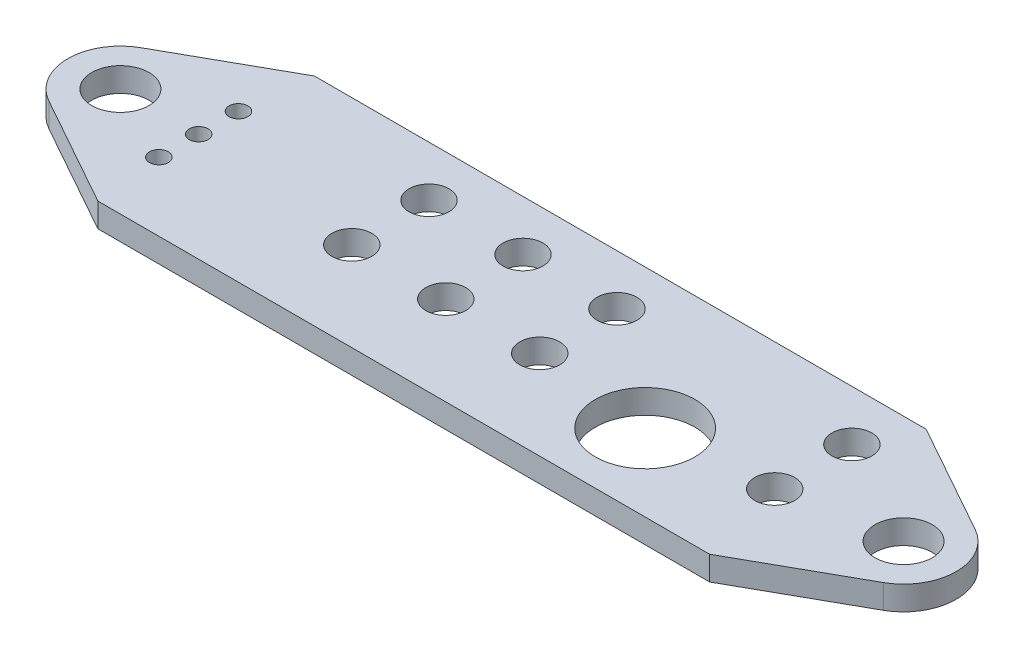
ISO-10303-21;
HEADER;
FILE_DESCRIPTION(('STEP AP214'),'2;1');
FILE_NAME('part.step','',(''),(''),'','','');
FILE_SCHEMA(('AUTOMOTIVE_DESIGN { 1 0 10303 214 1 1 1 1 }'));
ENDSEC;
DATA;
#1=APPLICATION_CONTEXT('core data for automotive mechanical design processes');
#2=APPLICATION_PROTOCOL_DEFINITION('international standard','automotive_design',2000,#1);
#3=PRODUCT_CONTEXT('',#1,'mechanical');
#4=PRODUCT('Part','Part','',(#3));
#5=PRODUCT_RELATED_PRODUCT_CATEGORY('part','',(#4));
#6=PRODUCT_DEFINITION_FORMATION('','',#4);
#7=PRODUCT_DEFINITION_CONTEXT('part definition',#1,'design');
#8=PRODUCT_DEFINITION('design','',#6,#7);
#9=PRODUCT_DEFINITION_SHAPE('','',#8);
#10=(LENGTH_UNIT() NAMED_UNIT(*) SI_UNIT(.MILLI.,.METRE.));
#11=(NAMED_UNIT(*) PLANE_ANGLE_UNIT() SI_UNIT($,.RADIAN.));
#12=(NAMED_UNIT(*) SI_UNIT($,.STERADIAN.) SOLID_ANGLE_UNIT());
#13=UNCERTAINTY_MEASURE_WITH_UNIT(LENGTH_MEASURE(1.E-05),#10,'distance_accuracy_value','');
#14=(GEOMETRIC_REPRESENTATION_CONTEXT(3) GLOBAL_UNCERTAINTY_ASSIGNED_CONTEXT((#13)) GLOBAL_UNIT_ASSIGNED_CONTEXT((#10,
#11,#12)) REPRESENTATION_CONTEXT('',''));
#15=CARTESIAN_POINT('',(0.,0.,0.));
#16=DIRECTION('',(0.,0.,1.));
#17=DIRECTION('',(1.,0.,0.));
#18=AXIS2_PLACEMENT_3D('',#15,#16,#17);
#19=CARTESIAN_POINT('',(-26.0415881249999,-1.6,0.000105833333350347));
#20=DIRECTION('',(0.,1.,0.));
#21=DIRECTION('',(1.,0.,0.));
#22=AXIS2_PLACEMENT_3D('',#19,#20,#21);
#23=PLANE('',#22);
#24=CARTESIAN_POINT('',(0.,-1.6,0.));
#25=DIRECTION('',(0.,1.,0.));
#26=DIRECTION('',(-1.,0.,0.));
#27=AXIS2_PLACEMENT_3D('',#24,#25,#26);
#28=CIRCLE('',#27,1.90624354166673);
#29=CARTESIAN_POINT('',(1.90624354166673,-1.6,0.));
#30=VERTEX_POINT('',#29);
#31=EDGE_CURVE('E426',#30,#30,#28,.T.);
#32=ORIENTED_EDGE('',*,*,#31,.T.);
#33=EDGE_LOOP('',(#32));
#34=FACE_BOUND('',#33,.T.);
#35=CARTESIAN_POINT('',(-52.083414375,-1.6,-0.000132291666687934));
#36=DIRECTION('',(0.,1.,0.));
#37=DIRECTION('',(-1.,0.,0.));
#38=AXIS2_PLACEMENT_3D('',#35,#36,#37);
#39=CIRCLE('',#38,1.90624354166673);
#40=CARTESIAN_POINT('',(-50.1771708333332,-1.6,-0.000132291666687934));
#41=VERTEX_POINT('',#40);
#42=EDGE_CURVE('E276',#41,#41,#39,.T.);
#43=ORIENTED_EDGE('',*,*,#42,.T.);
#44=EDGE_LOOP('',(#43));
#45=FACE_BOUND('',#44,.T.);
#46=CARTESIAN_POINT('',(-46.8772610416666,-1.6,2.64593916666669));
#47=DIRECTION('',(0.,1.,0.));
#48=DIRECTION('',(-1.,0.,0.));
#49=AXIS2_PLACEMENT_3D('',#46,#47,#48);
#50=CIRCLE('',#49,0.624998750000003);
#51=CARTESIAN_POINT('',(-46.2522622916666,-1.6,2.64593916666669));
#52=VERTEX_POINT('',#51);
#53=EDGE_CURVE('E300',#52,#52,#50,.T.);
#54=ORIENTED_EDGE('',*,*,#53,.T.);
#55=EDGE_LOOP('',(#54));
#56=FACE_BOUND('',#55,.T.);
#57=CARTESIAN_POINT('',(-7.29146687499991,-1.6,1.27867833333326));
#58=DIRECTION('',(0.,1.,0.));
#59=DIRECTION('',(-1.,0.,0.));
#60=AXIS2_PLACEMENT_3D('',#57,#58,#59);
#61=CIRCLE('',#60,1.32812895833339);
#62=CARTESIAN_POINT('',(-5.96333791666652,-1.6,1.27867833333326));
#63=VERTEX_POINT('',#62);
#64=EDGE_CURVE('E290',#63,#63,#61,.T.);
#65=ORIENTED_EDGE('',*,*,#64,.T.);
#66=EDGE_LOOP('',(#65));
#67=FACE_BOUND('',#66,.T.);
#68=CARTESIAN_POINT('',(-35.4163841666667,-1.6,-3.85431770833335));
#69=DIRECTION('',(0.,1.,0.));
#70=DIRECTION('',(-1.,0.,0.));
#71=AXIS2_PLACEMENT_3D('',#68,#69,#70);
#72=CIRCLE('',#71,1.32812895833339);
#73=CARTESIAN_POINT('',(-34.0882552083333,-1.6,-3.85431770833335));
#74=VERTEX_POINT('',#73);
#75=EDGE_CURVE('E259',#74,#74,#72,.T.);
#76=ORIENTED_EDGE('',*,*,#75,.T.);
#77=EDGE_LOOP('',(#76));
#78=FACE_BOUND('',#77,.T.);
#79=CARTESIAN_POINT('',(-46.8772610416666,-1.6,0.000105833333350347));
#80=DIRECTION('',(0.,1.,0.));
#81=DIRECTION('',(-1.,0.,0.));
#82=AXIS2_PLACEMENT_3D('',#79,#80,#81);
#83=CIRCLE('',#82,0.624998750000003);
#84=CARTESIAN_POINT('',(-46.2522622916666,-1.6,0.000105833333350347));
#85=VERTEX_POINT('',#84);
#86=EDGE_CURVE('E265',#85,#85,#83,.T.);
#87=ORIENTED_EDGE('',*,*,#86,.T.);
#88=EDGE_LOOP('',(#87));
#89=FACE_BOUND('',#88,.T.);
#90=CARTESIAN_POINT('',(-29.166423125,-1.6,-3.85431770833335));
#91=DIRECTION('',(0.,1.,0.));
#92=DIRECTION('',(-1.,0.,0.));
#93=AXIS2_PLACEMENT_3D('',#90,#91,#92);
#94=CIRCLE('',#93,1.32812895833339);
#95=CARTESIAN_POINT('',(-27.8382941666666,-1.6,-3.85431770833335));
#96=VERTEX_POINT('',#95);
#97=EDGE_CURVE('E307',#96,#96,#94,.T.);
#98=ORIENTED_EDGE('',*,*,#97,.T.);
#99=EDGE_LOOP('',(#98));
#100=FACE_BOUND('',#99,.T.);
#101=CARTESIAN_POINT('',(-22.916435625,-1.6,1.27867833333326));
#102=DIRECTION('',(0.,1.,0.));
#103=DIRECTION('',(-1.,0.,0.));
#104=AXIS2_PLACEMENT_3D('',#101,#102,#103);
#105=CIRCLE('',#104,1.32812895833339);
#106=CARTESIAN_POINT('',(-21.5883066666666,-1.6,1.27867833333326));
#107=VERTEX_POINT('',#106);
#108=EDGE_CURVE('E292',#107,#107,#105,.T.);
#109=ORIENTED_EDGE('',*,*,#108,.T.);
#110=EDGE_LOOP('',(#109));
#111=FACE_BOUND('',#110,.T.);
#112=CARTESIAN_POINT('',(-46.8772610416666,-1.6,-2.64572749999999));
#113=DIRECTION('',(0.,1.,0.));
#114=DIRECTION('',(-1.,0.,0.));
#115=AXIS2_PLACEMENT_3D('',#112,#113,#114);
#116=CIRCLE('',#115,0.624998750000003);
#117=CARTESIAN_POINT('',(-46.2522622916666,-1.6,-2.64572749999999));
#118=VERTEX_POINT('',#117);
#119=EDGE_CURVE('E282',#118,#118,#116,.T.);
#120=ORIENTED_EDGE('',*,*,#119,.T.);
#121=EDGE_LOOP('',(#120));
#122=FACE_BOUND('',#121,.T.);
#123=CARTESIAN_POINT('',(-15.1039777083332,-1.6,2.083435));
#124=DIRECTION('',(0.,1.,0.));
#125=DIRECTION('',(-1.,0.,0.));
#126=AXIS2_PLACEMENT_3D('',#123,#124,#125);
#127=CIRCLE('',#126,3.31250395833337);
#128=CARTESIAN_POINT('',(-11.7914737499999,-1.6,2.083435));
#129=VERTEX_POINT('',#128);
#130=EDGE_CURVE('E352',#129,#129,#127,.T.);
#131=ORIENTED_EDGE('',*,*,#130,.T.);
#132=EDGE_LOOP('',(#131));
#133=FACE_BOUND('',#132,.T.);
#134=CARTESIAN_POINT('',(-29.166423125,-1.6,1.27867833333326));
#135=DIRECTION('',(0.,1.,0.));
#136=DIRECTION('',(-1.,0.,0.));
#137=AXIS2_PLACEMENT_3D('',#134,#135,#136);
#138=CIRCLE('',#137,1.32812895833339);
#139=CARTESIAN_POINT('',(-27.8382941666666,-1.6,1.27867833333326));
#140=VERTEX_POINT('',#139);
#141=EDGE_CURVE('E329',#140,#140,#138,.T.);
#142=ORIENTED_EDGE('',*,*,#141,.T.);
#143=EDGE_LOOP('',(#142));
#144=FACE_BOUND('',#143,.T.);
#145=CARTESIAN_POINT('',(-7.29133458333322,-1.6,-3.85429125000002));
#146=DIRECTION('',(0.,1.,0.));
#147=DIRECTION('',(-1.,0.,0.));
#148=AXIS2_PLACEMENT_3D('',#145,#146,#147);
#149=CIRCLE('',#148,1.32812895833339);
#150=CARTESIAN_POINT('',(-5.96320562499983,-1.6,-3.85429125000002));
#151=VERTEX_POINT('',#150);
#152=EDGE_CURVE('E318',#151,#151,#149,.T.);
#153=ORIENTED_EDGE('',*,*,#152,.T.);
#154=EDGE_LOOP('',(#153));
#155=FACE_BOUND('',#154,.T.);
#156=CARTESIAN_POINT('',(-22.9164091666667,-1.6,-3.85431770833335));
#157=DIRECTION('',(0.,1.,0.));
#158=DIRECTION('',(-1.,0.,0.));
#159=AXIS2_PLACEMENT_3D('',#156,#157,#158);
#160=CIRCLE('',#159,1.32812895833339);
#161=CARTESIAN_POINT('',(-21.5882802083333,-1.6,-3.85431770833335));
#162=VERTEX_POINT('',#161);
#163=EDGE_CURVE('E258',#162,#162,#160,.T.);
#164=ORIENTED_EDGE('',*,*,#163,.T.);
#165=EDGE_LOOP('',(#164));
#166=FACE_BOUND('',#165,.T.);
#167=CARTESIAN_POINT('',(-35.4164106249999,-1.6,1.27867833333326));
#168=DIRECTION('',(0.,1.,0.));
#169=DIRECTION('',(-1.,0.,0.));
#170=AXIS2_PLACEMENT_3D('',#167,#168,#169);
#171=CIRCLE('',#170,1.32812895833339);
#172=CARTESIAN_POINT('',(-34.0882816666665,-1.6,1.27867833333326));
#173=VERTEX_POINT('',#172);
#174=EDGE_CURVE('E313',#173,#173,#171,.T.);
#175=ORIENTED_EDGE('',*,*,#174,.T.);
#176=EDGE_LOOP('',(#175));
#177=FACE_BOUND('',#176,.T.);
#178=DIRECTION('',(-1.,0.,0.));
#179=VECTOR('',#178,1.);
#180=CARTESIAN_POINT('',(-46.3832027083333,-1.6,7.20010583333334));
#181=LINE('',#180,#179);
#182=CARTESIAN_POINT('',(-5.69997354166645,-1.6,7.20010583333334));
#183=VERTEX_POINT('',#182);
#184=CARTESIAN_POINT('',(-46.3832027083333,-1.6,7.20010583333334));
#185=VERTEX_POINT('',#184);
#186=EDGE_CURVE('E11',#183,#185,#181,.T.);
#187=ORIENTED_EDGE('',*,*,#186,.T.);
#188=DIRECTION('',(-0.872678363940278,0.,-0.4882954772579));
#189=VECTOR('',#188,1.);
#190=CARTESIAN_POINT('',(-46.3832027083333,-1.6,7.20010583333334));
#191=LINE('',#190,#189);
#192=CARTESIAN_POINT('',(-53.7922368787561,-1.6,3.05448010711302));
#193=VERTEX_POINT('',#192);
#194=EDGE_CURVE('E286',#185,#193,#191,.T.);
#195=ORIENTED_EDGE('',*,*,#194,.T.);
#196=CARTESIAN_POINT('',(-52.0832027083333,-1.6,0.000105833333350347));
#197=DIRECTION('',(0.,-1.,0.));
#198=DIRECTION('',(-0.488295477259811,0.,-0.872678363939208));
#199=AXIS2_PLACEMENT_3D('',#196,#197,#198);
#200=CIRCLE('',#199,3.5);
#201=CARTESIAN_POINT('',(-53.7922368787426,-1.6,-3.05426844045385));
#202=VERTEX_POINT('',#201);
#203=EDGE_CURVE('E340',#193,#202,#200,.T.);
#204=ORIENTED_EDGE('',*,*,#203,.T.);
#205=DIRECTION('',(0.872678363940276,0.,-0.488295477257902));
#206=VECTOR('',#205,1.);
#207=CARTESIAN_POINT('',(-46.3832027083333,-1.6,-7.19989416666664));
#208=LINE('',#207,#206);
#209=CARTESIAN_POINT('',(-46.3832027083333,-1.6,-7.19989416666664));
#210=VERTEX_POINT('',#209);
#211=EDGE_CURVE('E248',#202,#210,#208,.T.);
#212=ORIENTED_EDGE('',*,*,#211,.T.);
#213=DIRECTION('',(1.,0.,0.));
#214=VECTOR('',#213,1.);
#215=CARTESIAN_POINT('',(-46.3832027083333,-1.6,-7.19989416666664));
#216=LINE('',#215,#214);
#217=CARTESIAN_POINT('',(-5.69997354166645,-1.6,-7.19989416666664));
#218=VERTEX_POINT('',#217);
#219=EDGE_CURVE('E378',#210,#218,#216,.T.);
#220=ORIENTED_EDGE('',*,*,#219,.T.);
#221=DIRECTION('',(0.872678363940276,0.,0.488295477257902));
#222=VECTOR('',#221,1.);
#223=CARTESIAN_POINT('',(-5.69997354166645,-1.6,-7.19989416666664));
#224=LINE('',#223,#222);
#225=CARTESIAN_POINT('',(1.7090606287428,-1.6,-3.05426844045385));
#226=VERTEX_POINT('',#225);
#227=EDGE_CURVE('E218',#218,#226,#224,.T.);
#228=ORIENTED_EDGE('',*,*,#227,.T.);
#229=CARTESIAN_POINT('',(2.64583334796953E-05,-1.6,0.000105833333350347));
#230=DIRECTION('',(0.,-1.,0.));
#231=DIRECTION('',(0.488295477263666,0.,0.872678363937052));
#232=AXIS2_PLACEMENT_3D('',#229,#230,#231);
#233=CIRCLE('',#232,3.5);
#234=CARTESIAN_POINT('',(1.7090606287563,-1.6,3.05448010711302));
#235=VERTEX_POINT('',#234);
#236=EDGE_CURVE('E21',#226,#235,#233,.T.);
#237=ORIENTED_EDGE('',*,*,#236,.T.);
#238=DIRECTION('',(-0.872678363940278,0.,0.4882954772579));
#239=VECTOR('',#238,1.);
#240=CARTESIAN_POINT('',(-5.69997354166645,-1.6,7.20010583333334));
#241=LINE('',#240,#239);
#242=EDGE_CURVE('E214',#235,#183,#241,.T.);
#243=ORIENTED_EDGE('',*,*,#242,.T.);
#244=EDGE_LOOP('',(#187,#195,#204,#212,#220,#228,#237,#243));
#245=FACE_BOUND('',#244,.T.);
#246=ADVANCED_FACE('F17',(#34,#45,#56,#67,#78,#89,#100,#111,#122,#133,#144,#155,#166,#177,#245),
#23,.F.);
#247=CARTESIAN_POINT('',(-26.0415881249999,0.,0.000105833333350347));
#248=DIRECTION('',(0.,1.,0.));
#249=DIRECTION('',(1.,0.,0.));
#250=AXIS2_PLACEMENT_3D('',#247,#248,#249);
#251=PLANE('',#250);
#252=CARTESIAN_POINT('',(0.,0.,0.));
#253=DIRECTION('',(0.,-1.,0.));
#254=DIRECTION('',(-1.,0.,0.));
#255=AXIS2_PLACEMENT_3D('',#252,#253,#254);
#256=CIRCLE('',#255,1.90624354166673);
#257=CARTESIAN_POINT('',(1.90624354166673,0.,0.));
#258=VERTEX_POINT('',#257);
#259=EDGE_CURVE('E406',#258,#258,#256,.T.);
#260=ORIENTED_EDGE('',*,*,#259,.T.);
#261=EDGE_LOOP('',(#260));
#262=FACE_BOUND('',#261,.T.);
#263=CARTESIAN_POINT('',(-52.083414375,0.,-0.000132291666687934));
#264=DIRECTION('',(0.,-1.,0.));
#265=DIRECTION('',(-1.,0.,0.));
#266=AXIS2_PLACEMENT_3D('',#263,#264,#265);
#267=CIRCLE('',#266,1.90624354166673);
#268=CARTESIAN_POINT('',(-50.1771708333332,0.,-0.000132291666687934));
#269=VERTEX_POINT('',#268);
#270=EDGE_CURVE('E275',#269,#269,#267,.T.);
#271=ORIENTED_EDGE('',*,*,#270,.T.);
#272=EDGE_LOOP('',(#271));
#273=FACE_BOUND('',#272,.T.);
#274=CARTESIAN_POINT('',(-46.8772610416666,0.,2.64593916666669));
#275=DIRECTION('',(0.,-1.,0.));
#276=DIRECTION('',(-1.,0.,0.));
#277=AXIS2_PLACEMENT_3D('',#274,#275,#276);
#278=CIRCLE('',#277,0.624998750000003);
#279=CARTESIAN_POINT('',(-46.2522622916666,0.,2.64593916666669));
#280=VERTEX_POINT('',#279);
#281=EDGE_CURVE('E287',#280,#280,#278,.T.);
#282=ORIENTED_EDGE('',*,*,#281,.T.);
#283=EDGE_LOOP('',(#282));
#284=FACE_BOUND('',#283,.T.);
#285=CARTESIAN_POINT('',(-7.29146687499991,0.,1.27867833333326));
#286=DIRECTION('',(0.,-1.,0.));
#287=DIRECTION('',(-1.,0.,0.));
#288=AXIS2_PLACEMENT_3D('',#285,#286,#287);
#289=CIRCLE('',#288,1.32812895833339);
#290=CARTESIAN_POINT('',(-5.96333791666652,0.,1.27867833333326));
#291=VERTEX_POINT('',#290);
#292=EDGE_CURVE('E263',#291,#291,#289,.T.);
#293=ORIENTED_EDGE('',*,*,#292,.T.);
#294=EDGE_LOOP('',(#293));
#295=FACE_BOUND('',#294,.T.);
#296=CARTESIAN_POINT('',(-35.4163841666667,0.,-3.85431770833335));
#297=DIRECTION('',(0.,-1.,0.));
#298=DIRECTION('',(-1.,0.,0.));
#299=AXIS2_PLACEMENT_3D('',#296,#297,#298);
#300=CIRCLE('',#299,1.32812895833339);
#301=CARTESIAN_POINT('',(-34.0882552083333,0.,-3.85431770833335));
#302=VERTEX_POINT('',#301);
#303=EDGE_CURVE('E270',#302,#302,#300,.T.);
#304=ORIENTED_EDGE('',*,*,#303,.T.);
#305=EDGE_LOOP('',(#304));
#306=FACE_BOUND('',#305,.T.);
#307=CARTESIAN_POINT('',(-46.8772610416666,0.,0.000105833333350347));
#308=DIRECTION('',(0.,-1.,0.));
#309=DIRECTION('',(-1.,0.,0.));
#310=AXIS2_PLACEMENT_3D('',#307,#308,#309);
#311=CIRCLE('',#310,0.624998750000003);
#312=CARTESIAN_POINT('',(-46.2522622916666,0.,0.000105833333350347));
#313=VERTEX_POINT('',#312);
#314=EDGE_CURVE('E304',#313,#313,#311,.T.);
#315=ORIENTED_EDGE('',*,*,#314,.T.);
#316=EDGE_LOOP('',(#315));
#317=FACE_BOUND('',#316,.T.);
#318=CARTESIAN_POINT('',(-29.166423125,0.,-3.85431770833335));
#319=DIRECTION('',(0.,-1.,0.));
#320=DIRECTION('',(-1.,0.,0.));
#321=AXIS2_PLACEMENT_3D('',#318,#319,#320);
#322=CIRCLE('',#321,1.32812895833339);
#323=CARTESIAN_POINT('',(-27.8382941666666,0.,-3.85431770833335));
#324=VERTEX_POINT('',#323);
#325=EDGE_CURVE('E297',#324,#324,#322,.T.);
#326=ORIENTED_EDGE('',*,*,#325,.T.);
#327=EDGE_LOOP('',(#326));
#328=FACE_BOUND('',#327,.T.);
#329=CARTESIAN_POINT('',(-22.916435625,0.,1.27867833333326));
#330=DIRECTION('',(0.,-1.,0.));
#331=DIRECTION('',(-1.,0.,0.));
#332=AXIS2_PLACEMENT_3D('',#329,#330,#331);
#333=CIRCLE('',#332,1.32812895833339);
#334=CARTESIAN_POINT('',(-21.5883066666666,0.,1.27867833333326));
#335=VERTEX_POINT('',#334);
#336=EDGE_CURVE('E385',#335,#335,#333,.T.);
#337=ORIENTED_EDGE('',*,*,#336,.T.);
#338=EDGE_LOOP('',(#337));
#339=FACE_BOUND('',#338,.T.);
#340=CARTESIAN_POINT('',(-46.8772610416666,0.,-2.64572749999999));
#341=DIRECTION('',(0.,-1.,0.));
#342=DIRECTION('',(-1.,0.,0.));
#343=AXIS2_PLACEMENT_3D('',#340,#341,#342);
#344=CIRCLE('',#343,0.624998750000003);
#345=CARTESIAN_POINT('',(-46.2522622916666,0.,-2.64572749999999));
#346=VERTEX_POINT('',#345);
#347=EDGE_CURVE('E281',#346,#346,#344,.T.);
#348=ORIENTED_EDGE('',*,*,#347,.T.);
#349=EDGE_LOOP('',(#348));
#350=FACE_BOUND('',#349,.T.);
#351=CARTESIAN_POINT('',(-15.1039777083332,0.,2.083435));
#352=DIRECTION('',(0.,-1.,0.));
#353=DIRECTION('',(-1.,0.,0.));
#354=AXIS2_PLACEMENT_3D('',#351,#352,#353);
#355=CIRCLE('',#354,3.31250395833337);
#356=CARTESIAN_POINT('',(-11.7914737499999,0.,2.083435));
#357=VERTEX_POINT('',#356);
#358=EDGE_CURVE('E346',#357,#357,#355,.T.);
#359=ORIENTED_EDGE('',*,*,#358,.T.);
#360=EDGE_LOOP('',(#359));
#361=FACE_BOUND('',#360,.T.);
#362=CARTESIAN_POINT('',(-29.166423125,0.,1.27867833333326));
#363=DIRECTION('',(0.,-1.,0.));
#364=DIRECTION('',(-1.,0.,0.));
#365=AXIS2_PLACEMENT_3D('',#362,#363,#364);
#366=CIRCLE('',#365,1.32812895833339);
#367=CARTESIAN_POINT('',(-27.8382941666666,0.,1.27867833333326));
#368=VERTEX_POINT('',#367);
#369=EDGE_CURVE('E148',#368,#368,#366,.T.);
#370=ORIENTED_EDGE('',*,*,#369,.T.);
#371=EDGE_LOOP('',(#370));
#372=FACE_BOUND('',#371,.T.);
#373=CARTESIAN_POINT('',(-7.29133458333322,0.,-3.85429125000002));
#374=DIRECTION('',(0.,-1.,0.));
#375=DIRECTION('',(-1.,0.,0.));
#376=AXIS2_PLACEMENT_3D('',#373,#374,#375);
#377=CIRCLE('',#376,1.32812895833339);
#378=CARTESIAN_POINT('',(-5.96320562499983,0.,-3.85429125000002));
#379=VERTEX_POINT('',#378);
#380=EDGE_CURVE('E402',#379,#379,#377,.T.);
#381=ORIENTED_EDGE('',*,*,#380,.T.);
#382=EDGE_LOOP('',(#381));
#383=FACE_BOUND('',#382,.T.);
#384=CARTESIAN_POINT('',(-22.9164091666667,0.,-3.85431770833335));
#385=DIRECTION('',(0.,-1.,0.));
#386=DIRECTION('',(-1.,0.,0.));
#387=AXIS2_PLACEMENT_3D('',#384,#385,#386);
#388=CIRCLE('',#387,1.32812895833339);
#389=CARTESIAN_POINT('',(-21.5882802083333,0.,-3.85431770833335));
#390=VERTEX_POINT('',#389);
#391=EDGE_CURVE('E257',#390,#390,#388,.T.);
#392=ORIENTED_EDGE('',*,*,#391,.T.);
#393=EDGE_LOOP('',(#392));
#394=FACE_BOUND('',#393,.T.);
#395=CARTESIAN_POINT('',(-35.4164106249999,0.,1.27867833333326));
#396=DIRECTION('',(0.,-1.,0.));
#397=DIRECTION('',(-1.,0.,0.));
#398=AXIS2_PLACEMENT_3D('',#395,#396,#397);
#399=CIRCLE('',#398,1.32812895833339);
#400=CARTESIAN_POINT('',(-34.0882816666665,0.,1.27867833333326));
#401=VERTEX_POINT('',#400);
#402=EDGE_CURVE('E312',#401,#401,#399,.T.);
#403=ORIENTED_EDGE('',*,*,#402,.T.);
#404=EDGE_LOOP('',(#403));
#405=FACE_BOUND('',#404,.T.);
#406=DIRECTION('',(1.,0.,0.));
#407=VECTOR('',#406,1.);
#408=CARTESIAN_POINT('',(-46.3832027083333,0.,7.20010583333334));
#409=LINE('',#408,#407);
#410=CARTESIAN_POINT('',(-46.3832027083333,0.,7.20010583333334));
#411=VERTEX_POINT('',#410);
#412=CARTESIAN_POINT('',(-5.69997354166645,0.,7.20010583333334));
#413=VERTEX_POINT('',#412);
#414=EDGE_CURVE('E28',#411,#413,#409,.T.);
#415=ORIENTED_EDGE('',*,*,#414,.T.);
#416=DIRECTION('',(0.872678363940278,0.,-0.4882954772579));
#417=VECTOR('',#416,1.);
#418=CARTESIAN_POINT('',(-5.69997354166645,0.,7.20010583333334));
#419=LINE('',#418,#417);
#420=CARTESIAN_POINT('',(1.7090606287563,0.,3.05448010711302));
#421=VERTEX_POINT('',#420);
#422=EDGE_CURVE('E242',#413,#421,#419,.T.);
#423=ORIENTED_EDGE('',*,*,#422,.T.);
#424=CARTESIAN_POINT('',(2.64583334796953E-05,0.,0.000105833333350347));
#425=DIRECTION('',(0.,1.,0.));
#426=DIRECTION('',(0.488295477263666,0.,0.872678363937052));
#427=AXIS2_PLACEMENT_3D('',#424,#425,#426);
#428=CIRCLE('',#427,3.5);
#429=CARTESIAN_POINT('',(1.7090606287428,0.,-3.05426844045385));
#430=VERTEX_POINT('',#429);
#431=EDGE_CURVE('E224',#421,#430,#428,.T.);
#432=ORIENTED_EDGE('',*,*,#431,.T.);
#433=DIRECTION('',(0.872678363940276,0.,0.488295477257902));
#434=VECTOR('',#433,1.);
#435=CARTESIAN_POINT('',(-5.69997354166645,0.,-7.19989416666664));
#436=LINE('',#435,#434);
#437=CARTESIAN_POINT('',(-5.69997354166645,0.,-7.19989416666664));
#438=VERTEX_POINT('',#437);
#439=EDGE_CURVE('E324',#438,#430,#436,.T.);
#440=ORIENTED_EDGE('',*,*,#439,.F.);
#441=DIRECTION('',(1.,0.,0.));
#442=VECTOR('',#441,1.);
#443=CARTESIAN_POINT('',(-46.3832027083333,0.,-7.19989416666664));
#444=LINE('',#443,#442);
#445=CARTESIAN_POINT('',(-46.3832027083333,0.,-7.19989416666664));
#446=VERTEX_POINT('',#445);
#447=EDGE_CURVE('E359',#446,#438,#444,.T.);
#448=ORIENTED_EDGE('',*,*,#447,.F.);
#449=DIRECTION('',(-0.872678363940276,0.,0.488295477257902));
#450=VECTOR('',#449,1.);
#451=CARTESIAN_POINT('',(-46.3832027083333,0.,-7.19989416666664));
#452=LINE('',#451,#450);
#453=CARTESIAN_POINT('',(-53.7922368787426,0.,-3.05426844045385));
#454=VERTEX_POINT('',#453);
#455=EDGE_CURVE('E252',#446,#454,#452,.T.);
#456=ORIENTED_EDGE('',*,*,#455,.T.);
#457=CARTESIAN_POINT('',(-52.0832027083333,0.,0.000105833333350347));
#458=DIRECTION('',(0.,1.,0.));
#459=DIRECTION('',(-0.488295477259811,0.,-0.872678363939208));
#460=AXIS2_PLACEMENT_3D('',#457,#458,#459);
#461=CIRCLE('',#460,3.5);
#462=CARTESIAN_POINT('',(-53.7922368787561,0.,3.05448010711302));
#463=VERTEX_POINT('',#462);
#464=EDGE_CURVE('E336',#454,#463,#461,.T.);
#465=ORIENTED_EDGE('',*,*,#464,.T.);
#466=DIRECTION('',(-0.872678363940278,0.,-0.4882954772579));
#467=VECTOR('',#466,1.);
#468=CARTESIAN_POINT('',(-46.3832027083333,0.,7.20010583333334));
#469=LINE('',#468,#467);
#470=EDGE_CURVE('E410',#411,#463,#469,.T.);
#471=ORIENTED_EDGE('',*,*,#470,.F.);
#472=EDGE_LOOP('',(#415,#423,#432,#440,#448,#456,#465,#471));
#473=FACE_BOUND('',#472,.T.);
#474=ADVANCED_FACE('F453',(#262,#273,#284,#295,#306,#317,#328,#339,#350,#361,#372,#383,#394,
#405,#473),#251,.T.);
#475=CARTESIAN_POINT('',(-5.69997354166659,0.,7.20010583333334));
#476=DIRECTION('',(0.,0.,1.));
#477=DIRECTION('',(1.,0.,0.));
#478=AXIS2_PLACEMENT_3D('',#475,#476,#477);
#479=PLANE('',#478);
#480=ORIENTED_EDGE('',*,*,#414,.F.);
#481=DIRECTION('',(0.,-1.,0.));
#482=VECTOR('',#481,1.);
#483=CARTESIAN_POINT('',(-46.3832027083333,0.,7.20010583333334));
#484=LINE('',#483,#482);
#485=EDGE_CURVE('E283',#411,#185,#484,.T.);
#486=ORIENTED_EDGE('',*,*,#485,.T.);
#487=ORIENTED_EDGE('',*,*,#186,.F.);
#488=DIRECTION('',(0.,-1.,0.));
#489=VECTOR('',#488,1.);
#490=CARTESIAN_POINT('',(-5.69997354166645,0.,7.20010583333334));
#491=LINE('',#490,#489);
#492=EDGE_CURVE('E236',#413,#183,#491,.T.);
#493=ORIENTED_EDGE('',*,*,#492,.F.);
#494=EDGE_LOOP('',(#480,#486,#487,#493));
#495=FACE_BOUND('',#494,.T.);
#496=ADVANCED_FACE('F457',(#495),#479,.T.);
#497=CARTESIAN_POINT('',(-46.3832027083333,0.,7.20010583333334));
#498=DIRECTION('',(-0.4882954772579,0.,0.872678363940278));
#499=DIRECTION('',(0.,1.,0.));
#500=AXIS2_PLACEMENT_3D('',#497,#498,#499);
#501=PLANE('',#500);
#502=ORIENTED_EDGE('',*,*,#470,.T.);
#503=DIRECTION('',(0.,-1.,0.));
#504=VECTOR('',#503,1.);
#505=CARTESIAN_POINT('',(-53.7922368787561,0.,3.05448010711302));
#506=LINE('',#505,#504);
#507=EDGE_CURVE('E405',#463,#193,#506,.T.);
#508=ORIENTED_EDGE('',*,*,#507,.T.);
#509=ORIENTED_EDGE('',*,*,#194,.F.);
#510=ORIENTED_EDGE('',*,*,#485,.F.);
#511=EDGE_LOOP('',(#502,#508,#509,#510));
#512=FACE_BOUND('',#511,.T.);
#513=ADVANCED_FACE('F461',(#512),#501,.T.);
#514=CARTESIAN_POINT('',(-52.0832027083333,0.,0.000105833333350347));
#515=DIRECTION('',(0.,-1.,0.));
#516=DIRECTION('',(-0.488295477259811,0.,-0.872678363939208));
#517=AXIS2_PLACEMENT_3D('',#514,#515,#516);
#518=CYLINDRICAL_SURFACE('',#517,3.5);
#519=ORIENTED_EDGE('',*,*,#464,.F.);
#520=DIRECTION('',(0.,-1.,0.));
#521=VECTOR('',#520,1.);
#522=CARTESIAN_POINT('',(-53.7922368787426,0.,-3.05426844045385));
#523=LINE('',#522,#521);
#524=EDGE_CURVE('E246',#454,#202,#523,.T.);
#525=ORIENTED_EDGE('',*,*,#524,.T.);
#526=ORIENTED_EDGE('',*,*,#203,.F.);
#527=ORIENTED_EDGE('',*,*,#507,.F.);
#528=EDGE_LOOP('',(#519,#525,#526,#527));
#529=FACE_BOUND('',#528,.T.);
#530=ADVANCED_FACE('F469',(#529),#518,.T.);
#531=CARTESIAN_POINT('',(-53.7922368787426,0.,-3.05426844045385));
#532=DIRECTION('',(-0.488295477257902,0.,-0.872678363940276));
#533=DIRECTION('',(-0.872678363940276,0.,0.488295477257902));
#534=AXIS2_PLACEMENT_3D('',#531,#532,#533);
#535=PLANE('',#534);
#536=ORIENTED_EDGE('',*,*,#455,.F.);
#537=DIRECTION('',(0.,-1.,0.));
#538=VECTOR('',#537,1.);
#539=CARTESIAN_POINT('',(-46.3832027083333,0.,-7.19989416666664));
#540=LINE('',#539,#538);
#541=EDGE_CURVE('E317',#446,#210,#540,.T.);
#542=ORIENTED_EDGE('',*,*,#541,.T.);
#543=ORIENTED_EDGE('',*,*,#211,.F.);
#544=ORIENTED_EDGE('',*,*,#524,.F.);
#545=EDGE_LOOP('',(#536,#542,#543,#544));
#546=FACE_BOUND('',#545,.T.);
#547=ADVANCED_FACE('F473',(#546),#535,.T.);
#548=CARTESIAN_POINT('',(-46.3832027083333,0.,-7.19989416666664));
#549=DIRECTION('',(0.,0.,-1.));
#550=DIRECTION('',(0.,-1.,0.));
#551=AXIS2_PLACEMENT_3D('',#548,#549,#550);
#552=PLANE('',#551);
#553=ORIENTED_EDGE('',*,*,#447,.T.);
#554=DIRECTION('',(0.,-1.,0.));
#555=VECTOR('',#554,1.);
#556=CARTESIAN_POINT('',(-5.69997354166645,0.,-7.19989416666664));
#557=LINE('',#556,#555);
#558=EDGE_CURVE('E323',#438,#218,#557,.T.);
#559=ORIENTED_EDGE('',*,*,#558,.T.);
#560=ORIENTED_EDGE('',*,*,#219,.F.);
#561=ORIENTED_EDGE('',*,*,#541,.F.);
#562=EDGE_LOOP('',(#553,#559,#560,#561));
#563=FACE_BOUND('',#562,.T.);
#564=ADVANCED_FACE('F446',(#563),#552,.T.);
#565=CARTESIAN_POINT('',(-5.69997354166645,0.,-7.19989416666664));
#566=DIRECTION('',(0.488295477257902,0.,-0.872678363940276));
#567=DIRECTION('',(0.,-1.,0.));
#568=AXIS2_PLACEMENT_3D('',#565,#566,#567);
#569=PLANE('',#568);
#570=ORIENTED_EDGE('',*,*,#439,.T.);
#571=DIRECTION('',(0.,-1.,0.));
#572=VECTOR('',#571,1.);
#573=CARTESIAN_POINT('',(1.7090606287428,0.,-3.05426844045385));
#574=LINE('',#573,#572);
#575=EDGE_CURVE('E223',#430,#226,#574,.T.);
#576=ORIENTED_EDGE('',*,*,#575,.T.);
#577=ORIENTED_EDGE('',*,*,#227,.F.);
#578=ORIENTED_EDGE('',*,*,#558,.F.);
#579=EDGE_LOOP('',(#570,#576,#577,#578));
#580=FACE_BOUND('',#579,.T.);
#581=ADVANCED_FACE('F452',(#580),#569,.T.);
#582=CARTESIAN_POINT('',(2.64583334796953E-05,0.,0.000105833333350347));
#583=DIRECTION('',(0.,-1.,0.));
#584=DIRECTION('',(0.488295477263666,0.,0.872678363937052));
#585=AXIS2_PLACEMENT_3D('',#582,#583,#584);
#586=CYLINDRICAL_SURFACE('',#585,3.5);
#587=ORIENTED_EDGE('',*,*,#431,.F.);
#588=DIRECTION('',(0.,-1.,0.));
#589=VECTOR('',#588,1.);
#590=CARTESIAN_POINT('',(1.7090606287563,0.,3.05448010711302));
#591=LINE('',#590,#589);
#592=EDGE_CURVE('E226',#421,#235,#591,.T.);
#593=ORIENTED_EDGE('',*,*,#592,.T.);
#594=ORIENTED_EDGE('',*,*,#236,.F.);
#595=ORIENTED_EDGE('',*,*,#575,.F.);
#596=EDGE_LOOP('',(#587,#593,#594,#595));
#597=FACE_BOUND('',#596,.T.);
#598=ADVANCED_FACE('F227',(#597),#586,.T.);
#599=CARTESIAN_POINT('',(1.7090606287563,0.,3.05448010711302));
#600=DIRECTION('',(0.4882954772579,0.,0.872678363940278));
#601=DIRECTION('',(0.,-1.,0.));
#602=AXIS2_PLACEMENT_3D('',#599,#600,#601);
#603=PLANE('',#602);
#604=ORIENTED_EDGE('',*,*,#422,.F.);
#605=ORIENTED_EDGE('',*,*,#492,.T.);
#606=ORIENTED_EDGE('',*,*,#242,.F.);
#607=ORIENTED_EDGE('',*,*,#592,.F.);
#608=EDGE_LOOP('',(#604,#605,#606,#607));
#609=FACE_BOUND('',#608,.T.);
#610=ADVANCED_FACE('F234',(#609),#603,.T.);
#611=CARTESIAN_POINT('',(-35.4164106249999,0.,1.27867833333326));
#612=DIRECTION('',(0.,-1.,0.));
#613=DIRECTION('',(-1.,0.,0.));
#614=AXIS2_PLACEMENT_3D('',#611,#612,#613);
#615=CYLINDRICAL_SURFACE('',#614,1.32812895833339);
#616=ORIENTED_EDGE('',*,*,#174,.F.);
#617=DIRECTION('',(0.,1.,0.));
#618=VECTOR('',#617,1.);
#619=CARTESIAN_POINT('',(-34.0882816666665,0.,1.27867833333326));
#620=LINE('',#619,#618);
#621=EDGE_CURVE('E308',#173,#401,#620,.T.);
#622=ORIENTED_EDGE('',*,*,#621,.T.);
#623=ORIENTED_EDGE('',*,*,#402,.F.);
#624=ORIENTED_EDGE('',*,*,#621,.F.);
#625=EDGE_LOOP('',(#616,#622,#623,#624));
#626=FACE_BOUND('',#625,.T.);
#627=ADVANCED_FACE('F19',(#626),#615,.F.);
#628=CARTESIAN_POINT('',(-22.9164091666667,0.,-3.85431770833335));
#629=DIRECTION('',(0.,-1.,0.));
#630=DIRECTION('',(-1.,0.,0.));
#631=AXIS2_PLACEMENT_3D('',#628,#629,#630);
#632=CYLINDRICAL_SURFACE('',#631,1.32812895833339);
#633=ORIENTED_EDGE('',*,*,#163,.F.);
#634=DIRECTION('',(0.,1.,0.));
#635=VECTOR('',#634,1.);
#636=CARTESIAN_POINT('',(-21.5882802083333,0.,-3.85431770833335));
#637=LINE('',#636,#635);
#638=EDGE_CURVE('E253',#162,#390,#637,.T.);
#639=ORIENTED_EDGE('',*,*,#638,.T.);
#640=ORIENTED_EDGE('',*,*,#391,.F.);
#641=ORIENTED_EDGE('',*,*,#638,.F.);
#642=EDGE_LOOP('',(#633,#639,#640,#641));
#643=FACE_BOUND('',#642,.T.);
#644=ADVANCED_FACE('F488',(#643),#632,.F.);
#645=CARTESIAN_POINT('',(-7.29133458333322,0.,-3.85429125000002));
#646=DIRECTION('',(0.,-1.,0.));
#647=DIRECTION('',(-1.,0.,0.));
#648=AXIS2_PLACEMENT_3D('',#645,#646,#647);
#649=CYLINDRICAL_SURFACE('',#648,1.32812895833339);
#650=ORIENTED_EDGE('',*,*,#152,.F.);
#651=DIRECTION('',(0.,1.,0.));
#652=VECTOR('',#651,1.);
#653=CARTESIAN_POINT('',(-5.96320562499983,0.,-3.85429125000002));
#654=LINE('',#653,#652);
#655=EDGE_CURVE('E134',#151,#379,#654,.T.);
#656=ORIENTED_EDGE('',*,*,#655,.T.);
#657=ORIENTED_EDGE('',*,*,#380,.F.);
#658=ORIENTED_EDGE('',*,*,#655,.F.);
#659=EDGE_LOOP('',(#650,#656,#657,#658));
#660=FACE_BOUND('',#659,.T.);
#661=ADVANCED_FACE('F521',(#660),#649,.F.);
#662=CARTESIAN_POINT('',(-29.166423125,0.,1.27867833333326));
#663=DIRECTION('',(0.,-1.,0.));
#664=DIRECTION('',(-1.,0.,0.));
#665=AXIS2_PLACEMENT_3D('',#662,#663,#664);
#666=CYLINDRICAL_SURFACE('',#665,1.32812895833339);
#667=ORIENTED_EDGE('',*,*,#141,.F.);
#668=DIRECTION('',(0.,1.,0.));
#669=VECTOR('',#668,1.);
#670=CARTESIAN_POINT('',(-27.8382941666666,0.,1.27867833333326));
#671=LINE('',#670,#669);
#672=EDGE_CURVE('E325',#140,#368,#671,.T.);
#673=ORIENTED_EDGE('',*,*,#672,.T.);
#674=ORIENTED_EDGE('',*,*,#369,.F.);
#675=ORIENTED_EDGE('',*,*,#672,.F.);
#676=EDGE_LOOP('',(#667,#673,#674,#675));
#677=FACE_BOUND('',#676,.T.);
#678=ADVANCED_FACE('F525',(#677),#666,.F.);
#679=CARTESIAN_POINT('',(-15.1039777083332,0.,2.083435));
#680=DIRECTION('',(0.,-1.,0.));
#681=DIRECTION('',(-1.,0.,0.));
#682=AXIS2_PLACEMENT_3D('',#679,#680,#681);
#683=CYLINDRICAL_SURFACE('',#682,3.31250395833337);
#684=ORIENTED_EDGE('',*,*,#130,.F.);
#685=DIRECTION('',(0.,1.,0.));
#686=VECTOR('',#685,1.);
#687=CARTESIAN_POINT('',(-11.7914737499999,0.,2.083435));
#688=LINE('',#687,#686);
#689=EDGE_CURVE('E349',#129,#357,#688,.T.);
#690=ORIENTED_EDGE('',*,*,#689,.T.);
#691=ORIENTED_EDGE('',*,*,#358,.F.);
#692=ORIENTED_EDGE('',*,*,#689,.F.);
#693=EDGE_LOOP('',(#684,#690,#691,#692));
#694=FACE_BOUND('',#693,.T.);
#695=ADVANCED_FACE('F604',(#694),#683,.F.);
#696=CARTESIAN_POINT('',(-46.8772610416666,0.,-2.64572749999999));
#697=DIRECTION('',(0.,-1.,0.));
#698=DIRECTION('',(-1.,0.,0.));
#699=AXIS2_PLACEMENT_3D('',#696,#697,#698);
#700=CYLINDRICAL_SURFACE('',#699,0.624998750000003);
#701=ORIENTED_EDGE('',*,*,#119,.F.);
#702=DIRECTION('',(0.,1.,0.));
#703=VECTOR('',#702,1.);
#704=CARTESIAN_POINT('',(-46.2522622916666,0.,-2.64572749999999));
#705=LINE('',#704,#703);
#706=EDGE_CURVE('E277',#118,#346,#705,.T.);
#707=ORIENTED_EDGE('',*,*,#706,.T.);
#708=ORIENTED_EDGE('',*,*,#347,.F.);
#709=ORIENTED_EDGE('',*,*,#706,.F.);
#710=EDGE_LOOP('',(#701,#707,#708,#709));
#711=FACE_BOUND('',#710,.T.);
#712=ADVANCED_FACE('F608',(#711),#700,.F.);
#713=CARTESIAN_POINT('',(-22.916435625,0.,1.27867833333326));
#714=DIRECTION('',(0.,-1.,0.));
#715=DIRECTION('',(-1.,0.,0.));
#716=AXIS2_PLACEMENT_3D('',#713,#714,#715);
#717=CYLINDRICAL_SURFACE('',#716,1.32812895833339);
#718=ORIENTED_EDGE('',*,*,#108,.F.);
#719=DIRECTION('',(0.,1.,0.));
#720=VECTOR('',#719,1.);
#721=CARTESIAN_POINT('',(-21.5883066666666,0.,1.27867833333326));
#722=LINE('',#721,#720);
#723=EDGE_CURVE('E296',#107,#335,#722,.T.);
#724=ORIENTED_EDGE('',*,*,#723,.T.);
#725=ORIENTED_EDGE('',*,*,#336,.F.);
#726=ORIENTED_EDGE('',*,*,#723,.F.);
#727=EDGE_LOOP('',(#718,#724,#725,#726));
#728=FACE_BOUND('',#727,.T.);
#729=ADVANCED_FACE('F515',(#728),#717,.F.);
#730=CARTESIAN_POINT('',(-29.166423125,0.,-3.85431770833335));
#731=DIRECTION('',(0.,-1.,0.));
#732=DIRECTION('',(-1.,0.,0.));
#733=AXIS2_PLACEMENT_3D('',#730,#731,#732);
#734=CYLINDRICAL_SURFACE('',#733,1.32812895833339);
#735=ORIENTED_EDGE('',*,*,#97,.F.);
#736=DIRECTION('',(0.,1.,0.));
#737=VECTOR('',#736,1.);
#738=CARTESIAN_POINT('',(-27.8382941666666,0.,-3.85431770833335));
#739=LINE('',#738,#737);
#740=EDGE_CURVE('E362',#96,#324,#739,.T.);
#741=ORIENTED_EDGE('',*,*,#740,.T.);
#742=ORIENTED_EDGE('',*,*,#325,.F.);
#743=ORIENTED_EDGE('',*,*,#740,.F.);
#744=EDGE_LOOP('',(#735,#741,#742,#743));
#745=FACE_BOUND('',#744,.T.);
#746=ADVANCED_FACE('F499',(#745),#734,.F.);
#747=CARTESIAN_POINT('',(-46.8772610416666,0.,0.000105833333350347));
#748=DIRECTION('',(0.,-1.,0.));
#749=DIRECTION('',(-1.,0.,0.));
#750=AXIS2_PLACEMENT_3D('',#747,#748,#749);
#751=CYLINDRICAL_SURFACE('',#750,0.624998750000003);
#752=ORIENTED_EDGE('',*,*,#86,.F.);
#753=DIRECTION('',(0.,1.,0.));
#754=VECTOR('',#753,1.);
#755=CARTESIAN_POINT('',(-46.2522622916666,0.,0.000105833333350423));
#756=LINE('',#755,#754);
#757=EDGE_CURVE('E269',#85,#313,#756,.T.);
#758=ORIENTED_EDGE('',*,*,#757,.T.);
#759=ORIENTED_EDGE('',*,*,#314,.F.);
#760=ORIENTED_EDGE('',*,*,#757,.F.);
#761=EDGE_LOOP('',(#752,#758,#759,#760));
#762=FACE_BOUND('',#761,.T.);
#763=ADVANCED_FACE('F494',(#762),#751,.F.);
#764=CARTESIAN_POINT('',(-35.4163841666667,0.,-3.85431770833335));
#765=DIRECTION('',(0.,-1.,0.));
#766=DIRECTION('',(-1.,0.,0.));
#767=AXIS2_PLACEMENT_3D('',#764,#765,#766);
#768=CYLINDRICAL_SURFACE('',#767,1.32812895833339);
#769=ORIENTED_EDGE('',*,*,#75,.F.);
#770=DIRECTION('',(0.,1.,0.));
#771=VECTOR('',#770,1.);
#772=CARTESIAN_POINT('',(-34.0882552083333,0.,-3.85431770833335));
#773=LINE('',#772,#771);
#774=EDGE_CURVE('E262',#74,#302,#773,.T.);
#775=ORIENTED_EDGE('',*,*,#774,.T.);
#776=ORIENTED_EDGE('',*,*,#303,.F.);
#777=ORIENTED_EDGE('',*,*,#774,.F.);
#778=EDGE_LOOP('',(#769,#775,#776,#777));
#779=FACE_BOUND('',#778,.T.);
#780=ADVANCED_FACE('F498',(#779),#768,.F.);
#781=CARTESIAN_POINT('',(-7.29146687499991,0.,1.27867833333326));
#782=DIRECTION('',(0.,-1.,0.));
#783=DIRECTION('',(-1.,0.,0.));
#784=AXIS2_PLACEMENT_3D('',#781,#782,#783);
#785=CYLINDRICAL_SURFACE('',#784,1.32812895833339);
#786=ORIENTED_EDGE('',*,*,#64,.F.);
#787=DIRECTION('',(0.,1.,0.));
#788=VECTOR('',#787,1.);
#789=CARTESIAN_POINT('',(-5.96333791666652,0.,1.27867833333326));
#790=LINE('',#789,#788);
#791=EDGE_CURVE('E330',#63,#291,#790,.T.);
#792=ORIENTED_EDGE('',*,*,#791,.T.);
#793=ORIENTED_EDGE('',*,*,#292,.F.);
#794=ORIENTED_EDGE('',*,*,#791,.F.);
#795=EDGE_LOOP('',(#786,#792,#793,#794));
#796=FACE_BOUND('',#795,.T.);
#797=ADVANCED_FACE('F554',(#796),#785,.F.);
#798=CARTESIAN_POINT('',(-46.8772610416666,0.,2.64593916666669));
#799=DIRECTION('',(0.,-1.,0.));
#800=DIRECTION('',(-1.,0.,0.));
#801=AXIS2_PLACEMENT_3D('',#798,#799,#800);
#802=CYLINDRICAL_SURFACE('',#801,0.624998750000003);
#803=ORIENTED_EDGE('',*,*,#53,.F.);
#804=DIRECTION('',(0.,1.,0.));
#805=VECTOR('',#804,1.);
#806=CARTESIAN_POINT('',(-46.2522622916666,0.,2.64593916666669));
#807=LINE('',#806,#805);
#808=EDGE_CURVE('E291',#52,#280,#807,.T.);
#809=ORIENTED_EDGE('',*,*,#808,.T.);
#810=ORIENTED_EDGE('',*,*,#281,.F.);
#811=ORIENTED_EDGE('',*,*,#808,.F.);
#812=EDGE_LOOP('',(#803,#809,#810,#811));
#813=FACE_BOUND('',#812,.T.);
#814=ADVANCED_FACE('F627',(#813),#802,.F.);
#815=CARTESIAN_POINT('',(-52.083414375,0.,-0.000132291666687934));
#816=DIRECTION('',(0.,-1.,0.));
#817=DIRECTION('',(-1.,0.,0.));
#818=AXIS2_PLACEMENT_3D('',#815,#816,#817);
#819=CYLINDRICAL_SURFACE('',#818,1.90624354166673);
#820=ORIENTED_EDGE('',*,*,#42,.F.);
#821=DIRECTION('',(0.,1.,0.));
#822=VECTOR('',#821,1.);
#823=CARTESIAN_POINT('',(-50.1771708333332,0.,-0.0001322916666877));
#824=LINE('',#823,#822);
#825=EDGE_CURVE('E271',#41,#269,#824,.T.);
#826=ORIENTED_EDGE('',*,*,#825,.T.);
#827=ORIENTED_EDGE('',*,*,#270,.F.);
#828=ORIENTED_EDGE('',*,*,#825,.F.);
#829=EDGE_LOOP('',(#820,#826,#827,#828));
#830=FACE_BOUND('',#829,.T.);
#831=ADVANCED_FACE('F622',(#830),#819,.F.);
#832=CARTESIAN_POINT('',(0.,0.,0.));
#833=DIRECTION('',(0.,-1.,0.));
#834=DIRECTION('',(-1.,0.,0.));
#835=AXIS2_PLACEMENT_3D('',#832,#833,#834);
#836=CYLINDRICAL_SURFACE('',#835,1.90624354166673);
#837=ORIENTED_EDGE('',*,*,#31,.F.);
#838=DIRECTION('',(0.,1.,0.));
#839=VECTOR('',#838,1.);
#840=CARTESIAN_POINT('',(1.90624354166673,0.,0.));
#841=LINE('',#840,#839);
#842=EDGE_CURVE('E409',#30,#258,#841,.T.);
#843=ORIENTED_EDGE('',*,*,#842,.T.);
#844=ORIENTED_EDGE('',*,*,#259,.F.);
#845=ORIENTED_EDGE('',*,*,#842,.F.);
#846=EDGE_LOOP('',(#837,#843,#844,#845));
#847=FACE_BOUND('',#846,.T.);
#848=ADVANCED_FACE('F626',(#847),#836,.F.);
#849=CLOSED_SHELL('',(#246,#474,#496,#513,#530,#547,#564,#581,#598,#610,#627,#644,#661,#678,
#695,#712,#729,#746,#763,#780,#797,#814,#831,#848));
#850=MANIFOLD_SOLID_BREP('B1',#849);
#851=ADVANCED_BREP_SHAPE_REPRESENTATION('',(#18,#850),#14);
#852=SHAPE_DEFINITION_REPRESENTATION(#9,#851);
ENDSEC;
END-ISO-10303-21;
